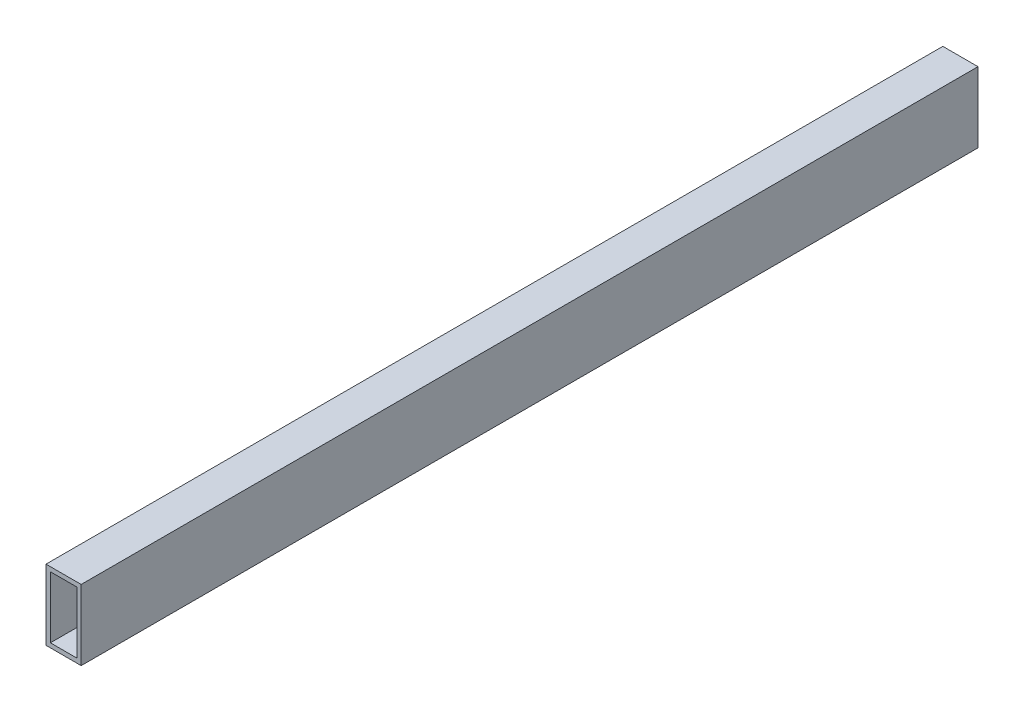
ISO-10303-21;
HEADER;
FILE_DESCRIPTION(('STEP AP214'),'2;1');
FILE_NAME('part.step','',(''),(''),'','','');
FILE_SCHEMA(('AUTOMOTIVE_DESIGN { 1 0 10303 214 1 1 1 1 }'));
ENDSEC;
DATA;
#1=APPLICATION_CONTEXT('core data for automotive mechanical design processes');
#2=APPLICATION_PROTOCOL_DEFINITION('international standard','automotive_design',2000,#1);
#3=PRODUCT_CONTEXT('',#1,'mechanical');
#4=PRODUCT('Part','Part','',(#3));
#5=PRODUCT_RELATED_PRODUCT_CATEGORY('part','',(#4));
#6=PRODUCT_DEFINITION_FORMATION('','',#4);
#7=PRODUCT_DEFINITION_CONTEXT('part definition',#1,'design');
#8=PRODUCT_DEFINITION('design','',#6,#7);
#9=PRODUCT_DEFINITION_SHAPE('','',#8);
#10=(LENGTH_UNIT() NAMED_UNIT(*) SI_UNIT(.MILLI.,.METRE.));
#11=(NAMED_UNIT(*) PLANE_ANGLE_UNIT() SI_UNIT($,.RADIAN.));
#12=(NAMED_UNIT(*) SI_UNIT($,.STERADIAN.) SOLID_ANGLE_UNIT());
#13=UNCERTAINTY_MEASURE_WITH_UNIT(LENGTH_MEASURE(1.E-05),#10,'distance_accuracy_value','');
#14=(GEOMETRIC_REPRESENTATION_CONTEXT(3) GLOBAL_UNCERTAINTY_ASSIGNED_CONTEXT((#13)) GLOBAL_UNIT_ASSIGNED_CONTEXT((#10,
#11,#12)) REPRESENTATION_CONTEXT('',''));
#15=CARTESIAN_POINT('',(0.,0.,0.));
#16=DIRECTION('',(0.,0.,1.));
#17=DIRECTION('',(1.,0.,0.));
#18=AXIS2_PLACEMENT_3D('',#15,#16,#17);
#19=CARTESIAN_POINT('',(0.,0.,323.85));
#20=DIRECTION('',(0.,0.,1.));
#21=DIRECTION('',(1.,0.,0.));
#22=AXIS2_PLACEMENT_3D('',#19,#20,#21);
#23=PLANE('',#22);
#24=DIRECTION('',(0.,1.,0.));
#25=VECTOR('',#24,1.);
#26=CARTESIAN_POINT('',(12.7,25.4,323.85));
#27=LINE('',#26,#25);
#28=CARTESIAN_POINT('',(12.7,-25.4,323.85));
#29=VERTEX_POINT('',#28);
#30=CARTESIAN_POINT('',(12.7,25.4,323.85));
#31=VERTEX_POINT('',#30);
#32=EDGE_CURVE('E133',#29,#31,#27,.T.);
#33=ORIENTED_EDGE('',*,*,#32,.T.);
#34=DIRECTION('',(-1.,0.,0.));
#35=VECTOR('',#34,1.);
#36=CARTESIAN_POINT('',(-12.7,25.4,323.85));
#37=LINE('',#36,#35);
#38=CARTESIAN_POINT('',(-12.7,25.4,323.85));
#39=VERTEX_POINT('',#38);
#40=EDGE_CURVE('E136',#31,#39,#37,.T.);
#41=ORIENTED_EDGE('',*,*,#40,.T.);
#42=DIRECTION('',(0.,-1.,0.));
#43=VECTOR('',#42,1.);
#44=CARTESIAN_POINT('',(-12.7,25.4,323.85));
#45=LINE('',#44,#43);
#46=CARTESIAN_POINT('',(-12.7,-25.4,323.85));
#47=VERTEX_POINT('',#46);
#48=EDGE_CURVE('E139',#39,#47,#45,.T.);
#49=ORIENTED_EDGE('',*,*,#48,.T.);
#50=DIRECTION('',(1.,0.,0.));
#51=VECTOR('',#50,1.);
#52=CARTESIAN_POINT('',(-12.7,-25.4,323.85));
#53=LINE('',#52,#51);
#54=EDGE_CURVE('E141',#47,#29,#53,.T.);
#55=ORIENTED_EDGE('',*,*,#54,.T.);
#56=EDGE_LOOP('',(#33,#41,#49,#55));
#57=FACE_BOUND('',#56,.T.);
#58=DIRECTION('',(1.,0.,0.));
#59=VECTOR('',#58,1.);
#60=CARTESIAN_POINT('',(-9.525,-22.225,323.85));
#61=LINE('',#60,#59);
#62=CARTESIAN_POINT('',(-9.525,-22.225,323.85));
#63=VERTEX_POINT('',#62);
#64=CARTESIAN_POINT('',(9.52500000000001,-22.225,323.85));
#65=VERTEX_POINT('',#64);
#66=EDGE_CURVE('E105',#63,#65,#61,.T.);
#67=ORIENTED_EDGE('',*,*,#66,.F.);
#68=DIRECTION('',(0.,-1.,0.));
#69=VECTOR('',#68,1.);
#70=CARTESIAN_POINT('',(-9.525,22.225,323.85));
#71=LINE('',#70,#69);
#72=CARTESIAN_POINT('',(-9.525,22.225,323.85));
#73=VERTEX_POINT('',#72);
#74=EDGE_CURVE('E97',#73,#63,#71,.T.);
#75=ORIENTED_EDGE('',*,*,#74,.F.);
#76=DIRECTION('',(-1.,0.,0.));
#77=VECTOR('',#76,1.);
#78=CARTESIAN_POINT('',(-9.525,22.225,323.85));
#79=LINE('',#78,#77);
#80=CARTESIAN_POINT('',(9.525,22.225,323.85));
#81=VERTEX_POINT('',#80);
#82=EDGE_CURVE('E119',#81,#73,#79,.T.);
#83=ORIENTED_EDGE('',*,*,#82,.F.);
#84=DIRECTION('',(0.,1.,0.));
#85=VECTOR('',#84,1.);
#86=CARTESIAN_POINT('',(9.525,22.225,323.85));
#87=LINE('',#86,#85);
#88=EDGE_CURVE('E117',#65,#81,#87,.T.);
#89=ORIENTED_EDGE('',*,*,#88,.F.);
#90=EDGE_LOOP('',(#67,#75,#83,#89));
#91=FACE_BOUND('',#90,.T.);
#92=ADVANCED_FACE('F32',(#57,#91),#23,.T.);
#93=CARTESIAN_POINT('',(0.,0.,-323.85));
#94=DIRECTION('',(0.,0.,1.));
#95=DIRECTION('',(1.,0.,0.));
#96=AXIS2_PLACEMENT_3D('',#93,#94,#95);
#97=PLANE('',#96);
#98=DIRECTION('',(0.,1.,0.));
#99=VECTOR('',#98,1.);
#100=CARTESIAN_POINT('',(12.7,25.4,-323.85));
#101=LINE('',#100,#99);
#102=CARTESIAN_POINT('',(12.7,-25.4,-323.85));
#103=VERTEX_POINT('',#102);
#104=CARTESIAN_POINT('',(12.7,25.4,-323.85));
#105=VERTEX_POINT('',#104);
#106=EDGE_CURVE('E113',#103,#105,#101,.T.);
#107=ORIENTED_EDGE('',*,*,#106,.F.);
#108=DIRECTION('',(1.,0.,0.));
#109=VECTOR('',#108,1.);
#110=CARTESIAN_POINT('',(-12.7,-25.4,-323.85));
#111=LINE('',#110,#109);
#112=CARTESIAN_POINT('',(-12.7,-25.4,-323.85));
#113=VERTEX_POINT('',#112);
#114=EDGE_CURVE('E137',#113,#103,#111,.T.);
#115=ORIENTED_EDGE('',*,*,#114,.F.);
#116=DIRECTION('',(0.,-1.,0.));
#117=VECTOR('',#116,1.);
#118=CARTESIAN_POINT('',(-12.7,25.4,-323.85));
#119=LINE('',#118,#117);
#120=CARTESIAN_POINT('',(-12.7,25.4,-323.85));
#121=VERTEX_POINT('',#120);
#122=EDGE_CURVE('E148',#121,#113,#119,.T.);
#123=ORIENTED_EDGE('',*,*,#122,.F.);
#124=DIRECTION('',(-1.,0.,0.));
#125=VECTOR('',#124,1.);
#126=CARTESIAN_POINT('',(-12.7,25.4,-323.85));
#127=LINE('',#126,#125);
#128=EDGE_CURVE('E146',#105,#121,#127,.T.);
#129=ORIENTED_EDGE('',*,*,#128,.F.);
#130=EDGE_LOOP('',(#107,#115,#123,#129));
#131=FACE_BOUND('',#130,.T.);
#132=DIRECTION('',(0.,-1.,0.));
#133=VECTOR('',#132,1.);
#134=CARTESIAN_POINT('',(-9.525,22.225,-323.85));
#135=LINE('',#134,#133);
#136=CARTESIAN_POINT('',(-9.525,22.225,-323.85));
#137=VERTEX_POINT('',#136);
#138=CARTESIAN_POINT('',(-9.525,-22.225,-323.85));
#139=VERTEX_POINT('',#138);
#140=EDGE_CURVE('E55',#137,#139,#135,.T.);
#141=ORIENTED_EDGE('',*,*,#140,.T.);
#142=DIRECTION('',(1.,0.,0.));
#143=VECTOR('',#142,1.);
#144=CARTESIAN_POINT('',(-9.525,-22.225,-323.85));
#145=LINE('',#144,#143);
#146=CARTESIAN_POINT('',(9.52500000000001,-22.225,-323.85));
#147=VERTEX_POINT('',#146);
#148=EDGE_CURVE('E112',#139,#147,#145,.T.);
#149=ORIENTED_EDGE('',*,*,#148,.T.);
#150=DIRECTION('',(0.,1.,0.));
#151=VECTOR('',#150,1.);
#152=CARTESIAN_POINT('',(9.525,22.225,-323.85));
#153=LINE('',#152,#151);
#154=CARTESIAN_POINT('',(9.525,22.225,-323.85));
#155=VERTEX_POINT('',#154);
#156=EDGE_CURVE('E125',#147,#155,#153,.T.);
#157=ORIENTED_EDGE('',*,*,#156,.T.);
#158=DIRECTION('',(-1.,0.,0.));
#159=VECTOR('',#158,1.);
#160=CARTESIAN_POINT('',(-9.525,22.225,-323.85));
#161=LINE('',#160,#159);
#162=EDGE_CURVE('E106',#155,#137,#161,.T.);
#163=ORIENTED_EDGE('',*,*,#162,.T.);
#164=EDGE_LOOP('',(#141,#149,#157,#163));
#165=FACE_BOUND('',#164,.T.);
#166=ADVANCED_FACE('F166',(#131,#165),#97,.F.);
#167=CARTESIAN_POINT('',(12.7,25.4,323.85));
#168=DIRECTION('',(-1.,0.,0.));
#169=DIRECTION('',(0.,-1.,0.));
#170=AXIS2_PLACEMENT_3D('',#167,#168,#169);
#171=PLANE('',#170);
#172=ORIENTED_EDGE('',*,*,#106,.T.);
#173=DIRECTION('',(0.,0.,-1.));
#174=VECTOR('',#173,1.);
#175=CARTESIAN_POINT('',(12.7,25.4,323.85));
#176=LINE('',#175,#174);
#177=EDGE_CURVE('E11',#31,#105,#176,.T.);
#178=ORIENTED_EDGE('',*,*,#177,.F.);
#179=ORIENTED_EDGE('',*,*,#32,.F.);
#180=DIRECTION('',(0.,0.,-1.));
#181=VECTOR('',#180,1.);
#182=CARTESIAN_POINT('',(12.7,-25.4,323.85));
#183=LINE('',#182,#181);
#184=EDGE_CURVE('E143',#29,#103,#183,.T.);
#185=ORIENTED_EDGE('',*,*,#184,.T.);
#186=EDGE_LOOP('',(#172,#178,#179,#185));
#187=FACE_BOUND('',#186,.T.);
#188=ADVANCED_FACE('F34',(#187),#171,.F.);
#189=CARTESIAN_POINT('',(-12.7,25.4,323.85));
#190=DIRECTION('',(0.,-1.,0.));
#191=DIRECTION('',(0.,0.,-1.));
#192=AXIS2_PLACEMENT_3D('',#189,#190,#191);
#193=PLANE('',#192);
#194=ORIENTED_EDGE('',*,*,#128,.T.);
#195=DIRECTION('',(0.,0.,-1.));
#196=VECTOR('',#195,1.);
#197=CARTESIAN_POINT('',(-12.7,25.4,323.85));
#198=LINE('',#197,#196);
#199=EDGE_CURVE('E40',#39,#121,#198,.T.);
#200=ORIENTED_EDGE('',*,*,#199,.F.);
#201=ORIENTED_EDGE('',*,*,#40,.F.);
#202=ORIENTED_EDGE('',*,*,#177,.T.);
#203=EDGE_LOOP('',(#194,#200,#201,#202));
#204=FACE_BOUND('',#203,.T.);
#205=ADVANCED_FACE('F176',(#204),#193,.F.);
#206=CARTESIAN_POINT('',(-12.7,25.4,323.85));
#207=DIRECTION('',(1.,0.,0.));
#208=DIRECTION('',(0.,1.,0.));
#209=AXIS2_PLACEMENT_3D('',#206,#207,#208);
#210=PLANE('',#209);
#211=ORIENTED_EDGE('',*,*,#122,.T.);
#212=DIRECTION('',(0.,0.,-1.));
#213=VECTOR('',#212,1.);
#214=CARTESIAN_POINT('',(-12.7,-25.4,323.85));
#215=LINE('',#214,#213);
#216=EDGE_CURVE('E153',#47,#113,#215,.T.);
#217=ORIENTED_EDGE('',*,*,#216,.F.);
#218=ORIENTED_EDGE('',*,*,#48,.F.);
#219=ORIENTED_EDGE('',*,*,#199,.T.);
#220=EDGE_LOOP('',(#211,#217,#218,#219));
#221=FACE_BOUND('',#220,.T.);
#222=ADVANCED_FACE('F160',(#221),#210,.F.);
#223=CARTESIAN_POINT('',(-12.7,-25.4,323.85));
#224=DIRECTION('',(0.,1.,0.));
#225=DIRECTION('',(0.,0.,1.));
#226=AXIS2_PLACEMENT_3D('',#223,#224,#225);
#227=PLANE('',#226);
#228=ORIENTED_EDGE('',*,*,#114,.T.);
#229=ORIENTED_EDGE('',*,*,#184,.F.);
#230=ORIENTED_EDGE('',*,*,#54,.F.);
#231=ORIENTED_EDGE('',*,*,#216,.T.);
#232=EDGE_LOOP('',(#228,#229,#230,#231));
#233=FACE_BOUND('',#232,.T.);
#234=ADVANCED_FACE('F170',(#233),#227,.F.);
#235=CARTESIAN_POINT('',(-9.525,22.225,323.85));
#236=DIRECTION('',(1.,0.,0.));
#237=DIRECTION('',(0.,1.,0.));
#238=AXIS2_PLACEMENT_3D('',#235,#236,#237);
#239=PLANE('',#238);
#240=ORIENTED_EDGE('',*,*,#140,.F.);
#241=DIRECTION('',(0.,0.,-1.));
#242=VECTOR('',#241,1.);
#243=CARTESIAN_POINT('',(-9.525,22.225,323.85));
#244=LINE('',#243,#242);
#245=EDGE_CURVE('E101',#73,#137,#244,.T.);
#246=ORIENTED_EDGE('',*,*,#245,.F.);
#247=ORIENTED_EDGE('',*,*,#74,.T.);
#248=DIRECTION('',(0.,0.,-1.));
#249=VECTOR('',#248,1.);
#250=CARTESIAN_POINT('',(-9.525,-22.225,323.85));
#251=LINE('',#250,#249);
#252=EDGE_CURVE('E100',#63,#139,#251,.T.);
#253=ORIENTED_EDGE('',*,*,#252,.T.);
#254=EDGE_LOOP('',(#240,#246,#247,#253));
#255=FACE_BOUND('',#254,.T.);
#256=ADVANCED_FACE('F99',(#255),#239,.T.);
#257=CARTESIAN_POINT('',(-9.525,-22.225,323.85));
#258=DIRECTION('',(0.,1.,0.));
#259=DIRECTION('',(-1.,0.,0.));
#260=AXIS2_PLACEMENT_3D('',#257,#258,#259);
#261=PLANE('',#260);
#262=ORIENTED_EDGE('',*,*,#148,.F.);
#263=ORIENTED_EDGE('',*,*,#252,.F.);
#264=ORIENTED_EDGE('',*,*,#66,.T.);
#265=DIRECTION('',(0.,0.,-1.));
#266=VECTOR('',#265,1.);
#267=CARTESIAN_POINT('',(9.52500000000001,-22.225,323.85));
#268=LINE('',#267,#266);
#269=EDGE_CURVE('E114',#65,#147,#268,.T.);
#270=ORIENTED_EDGE('',*,*,#269,.T.);
#271=EDGE_LOOP('',(#262,#263,#264,#270));
#272=FACE_BOUND('',#271,.T.);
#273=ADVANCED_FACE('F109',(#272),#261,.T.);
#274=CARTESIAN_POINT('',(9.525,22.225,323.85));
#275=DIRECTION('',(-1.,0.,0.));
#276=DIRECTION('',(0.,-1.,0.));
#277=AXIS2_PLACEMENT_3D('',#274,#275,#276);
#278=PLANE('',#277);
#279=ORIENTED_EDGE('',*,*,#156,.F.);
#280=ORIENTED_EDGE('',*,*,#269,.F.);
#281=ORIENTED_EDGE('',*,*,#88,.T.);
#282=DIRECTION('',(0.,0.,-1.));
#283=VECTOR('',#282,1.);
#284=CARTESIAN_POINT('',(9.525,22.225,323.85));
#285=LINE('',#284,#283);
#286=EDGE_CURVE('E47',#81,#155,#285,.T.);
#287=ORIENTED_EDGE('',*,*,#286,.T.);
#288=EDGE_LOOP('',(#279,#280,#281,#287));
#289=FACE_BOUND('',#288,.T.);
#290=ADVANCED_FACE('F199',(#289),#278,.T.);
#291=CARTESIAN_POINT('',(-9.525,22.225,323.85));
#292=DIRECTION('',(0.,-1.,0.));
#293=DIRECTION('',(0.,0.,-1.));
#294=AXIS2_PLACEMENT_3D('',#291,#292,#293);
#295=PLANE('',#294);
#296=ORIENTED_EDGE('',*,*,#162,.F.);
#297=ORIENTED_EDGE('',*,*,#286,.F.);
#298=ORIENTED_EDGE('',*,*,#82,.T.);
#299=ORIENTED_EDGE('',*,*,#245,.T.);
#300=EDGE_LOOP('',(#296,#297,#298,#299));
#301=FACE_BOUND('',#300,.T.);
#302=ADVANCED_FACE('F203',(#301),#295,.T.);
#303=CLOSED_SHELL('',(#92,#166,#188,#205,#222,#234,#256,#273,#290,#302));
#304=MANIFOLD_SOLID_BREP('B2',#303);
#305=ADVANCED_BREP_SHAPE_REPRESENTATION('',(#18,#304),#14);
#306=SHAPE_DEFINITION_REPRESENTATION(#9,#305);
ENDSEC;
END-ISO-10303-21;
